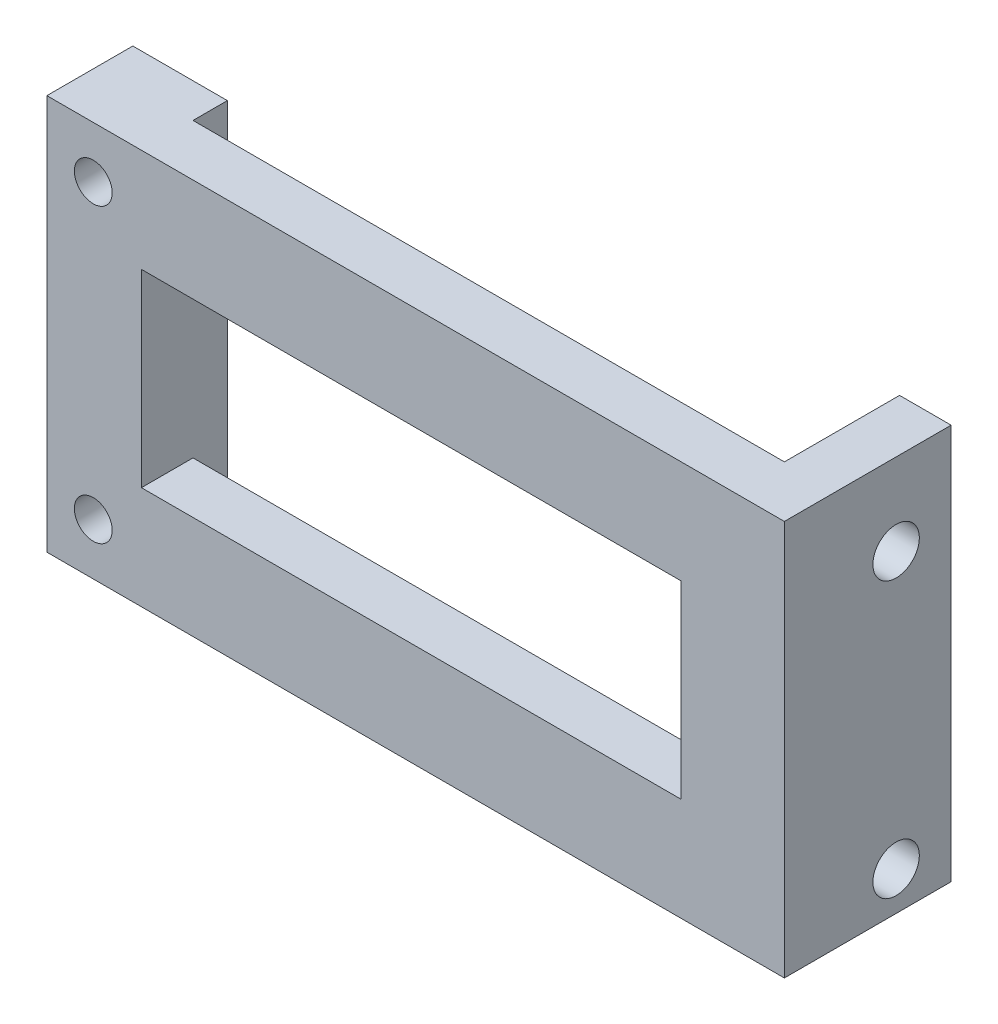
ISO-10303-21;
HEADER;
FILE_DESCRIPTION(('STEP AP214'),'2;1');
FILE_NAME('part.step','',(''),(''),'','','');
FILE_SCHEMA(('AUTOMOTIVE_DESIGN { 1 0 10303 214 1 1 1 1 }'));
ENDSEC;
DATA;
#1=APPLICATION_CONTEXT('core data for automotive mechanical design processes');
#2=APPLICATION_PROTOCOL_DEFINITION('international standard','automotive_design',2000,#1);
#3=PRODUCT_CONTEXT('',#1,'mechanical');
#4=PRODUCT('Part','Part','',(#3));
#5=PRODUCT_RELATED_PRODUCT_CATEGORY('part','',(#4));
#6=PRODUCT_DEFINITION_FORMATION('','',#4);
#7=PRODUCT_DEFINITION_CONTEXT('part definition',#1,'design');
#8=PRODUCT_DEFINITION('design','',#6,#7);
#9=PRODUCT_DEFINITION_SHAPE('','',#8);
#10=(LENGTH_UNIT() NAMED_UNIT(*) SI_UNIT(.MILLI.,.METRE.));
#11=(NAMED_UNIT(*) PLANE_ANGLE_UNIT() SI_UNIT($,.RADIAN.));
#12=(NAMED_UNIT(*) SI_UNIT($,.STERADIAN.) SOLID_ANGLE_UNIT());
#13=UNCERTAINTY_MEASURE_WITH_UNIT(LENGTH_MEASURE(1.E-05),#10,'distance_accuracy_value','');
#14=(GEOMETRIC_REPRESENTATION_CONTEXT(3) GLOBAL_UNCERTAINTY_ASSIGNED_CONTEXT((#13)) GLOBAL_UNIT_ASSIGNED_CONTEXT((#10,
#11,#12)) REPRESENTATION_CONTEXT('',''));
#15=CARTESIAN_POINT('',(0.,0.,0.));
#16=DIRECTION('',(0.,0.,1.));
#17=DIRECTION('',(1.,0.,0.));
#18=AXIS2_PLACEMENT_3D('',#15,#16,#17);
#19=CARTESIAN_POINT('',(0.,-5.50000000000001,-3.00000000000004));
#20=DIRECTION('',(0.,-1.,0.));
#21=DIRECTION('',(0.,0.,-1.));
#22=AXIS2_PLACEMENT_3D('',#19,#20,#21);
#23=PLANE('',#22);
#24=DIRECTION('',(-1.,0.,0.));
#25=VECTOR('',#24,1.);
#26=CARTESIAN_POINT('',(0.,-5.50000000000017,0.));
#27=LINE('',#26,#25);
#28=CARTESIAN_POINT('',(15.45,-5.50000000000014,0.));
#29=VERTEX_POINT('',#28);
#30=CARTESIAN_POINT('',(-15.9500000000002,-5.50000000000017,0.));
#31=VERTEX_POINT('',#30);
#32=EDGE_CURVE('E169',#29,#31,#27,.T.);
#33=ORIENTED_EDGE('',*,*,#32,.F.);
#34=DIRECTION('',(0.,0.,1.));
#35=VECTOR('',#34,1.);
#36=CARTESIAN_POINT('',(15.4499999999999,-5.50000000000014,-2.99999999999996));
#37=LINE('',#36,#35);
#38=CARTESIAN_POINT('',(15.4499999999999,-5.50000000000014,-2.99999999999996));
#39=VERTEX_POINT('',#38);
#40=EDGE_CURVE('E42',#39,#29,#37,.T.);
#41=ORIENTED_EDGE('',*,*,#40,.F.);
#42=DIRECTION('',(-1.,0.,0.));
#43=VECTOR('',#42,1.);
#44=CARTESIAN_POINT('',(0.,-5.50000000000001,-3.00000000000004));
#45=LINE('',#44,#43);
#46=CARTESIAN_POINT('',(-15.95,-5.50000000000017,-3.));
#47=VERTEX_POINT('',#46);
#48=EDGE_CURVE('E177',#39,#47,#45,.T.);
#49=ORIENTED_EDGE('',*,*,#48,.T.);
#50=DIRECTION('',(0.,0.,1.));
#51=VECTOR('',#50,1.);
#52=CARTESIAN_POINT('',(-15.95,-5.50000000000017,-3.));
#53=LINE('',#52,#51);
#54=EDGE_CURVE('E11',#47,#31,#53,.T.);
#55=ORIENTED_EDGE('',*,*,#54,.T.);
#56=EDGE_LOOP('',(#33,#41,#49,#55));
#57=FACE_BOUND('',#56,.T.);
#58=ADVANCED_FACE('F39',(#57),#23,.F.);
#59=CARTESIAN_POINT('',(0.,-11.5,-3.));
#60=DIRECTION('',(0.,1.,0.));
#61=DIRECTION('',(1.,0.,0.));
#62=AXIS2_PLACEMENT_3D('',#59,#60,#61);
#63=PLANE('',#62);
#64=DIRECTION('',(1.,0.,0.));
#65=VECTOR('',#64,1.);
#66=CARTESIAN_POINT('',(0.,-11.5000000000002,0.));
#67=LINE('',#66,#65);
#68=CARTESIAN_POINT('',(-21.4500000000002,-11.5000000000001,0.));
#69=VERTEX_POINT('',#68);
#70=CARTESIAN_POINT('',(21.45,-11.5,0.));
#71=VERTEX_POINT('',#70);
#72=EDGE_CURVE('E180',#69,#71,#67,.T.);
#73=ORIENTED_EDGE('',*,*,#72,.F.);
#74=DIRECTION('',(0.,0.,1.));
#75=VECTOR('',#74,1.);
#76=CARTESIAN_POINT('',(-21.4500000000002,-11.5000000000001,-5.));
#77=LINE('',#76,#75);
#78=CARTESIAN_POINT('',(-21.4500000000002,-11.5000000000001,-5.));
#79=VERTEX_POINT('',#78);
#80=EDGE_CURVE('E170',#79,#69,#77,.T.);
#81=ORIENTED_EDGE('',*,*,#80,.F.);
#82=DIRECTION('',(1.,0.,0.));
#83=VECTOR('',#82,1.);
#84=CARTESIAN_POINT('',(-1.66533453693773E-13,-11.5,-5.));
#85=LINE('',#84,#83);
#86=CARTESIAN_POINT('',(-15.9500000000002,-11.5000000000002,-5.));
#87=VERTEX_POINT('',#86);
#88=EDGE_CURVE('E150',#79,#87,#85,.T.);
#89=ORIENTED_EDGE('',*,*,#88,.T.);
#90=DIRECTION('',(0.,0.,1.));
#91=VECTOR('',#90,1.);
#92=CARTESIAN_POINT('',(-15.9500000000002,-11.5000000000002,-5.));
#93=LINE('',#92,#91);
#94=CARTESIAN_POINT('',(-15.9500000000002,-11.5000000000002,-3.));
#95=VERTEX_POINT('',#94);
#96=EDGE_CURVE('E173',#87,#95,#93,.T.);
#97=ORIENTED_EDGE('',*,*,#96,.T.);
#98=DIRECTION('',(1.,0.,0.));
#99=VECTOR('',#98,1.);
#100=CARTESIAN_POINT('',(0.,-11.5,-3.));
#101=LINE('',#100,#99);
#102=CARTESIAN_POINT('',(18.45,-11.5000000000002,-3.));
#103=VERTEX_POINT('',#102);
#104=EDGE_CURVE('E110',#95,#103,#101,.T.);
#105=ORIENTED_EDGE('',*,*,#104,.T.);
#106=DIRECTION('',(0.,0.,1.));
#107=VECTOR('',#106,1.);
#108=CARTESIAN_POINT('',(18.45,-11.5,-9.7));
#109=LINE('',#108,#107);
#110=CARTESIAN_POINT('',(18.45,-11.5,-9.7));
#111=VERTEX_POINT('',#110);
#112=EDGE_CURVE('E108',#111,#103,#109,.T.);
#113=ORIENTED_EDGE('',*,*,#112,.F.);
#114=DIRECTION('',(1.,0.,0.));
#115=VECTOR('',#114,1.);
#116=CARTESIAN_POINT('',(-1.66533453693773E-13,-11.5000000000002,-9.70000000000001));
#117=LINE('',#116,#115);
#118=CARTESIAN_POINT('',(21.4499999999999,-11.5,-9.7));
#119=VERTEX_POINT('',#118);
#120=EDGE_CURVE('E127',#111,#119,#117,.T.);
#121=ORIENTED_EDGE('',*,*,#120,.T.);
#122=DIRECTION('',(0.,0.,1.));
#123=VECTOR('',#122,1.);
#124=CARTESIAN_POINT('',(21.4499999999999,-11.5,-9.7));
#125=LINE('',#124,#123);
#126=EDGE_CURVE('E130',#119,#71,#125,.T.);
#127=ORIENTED_EDGE('',*,*,#126,.T.);
#128=EDGE_LOOP('',(#73,#81,#89,#97,#105,#113,#121,#127));
#129=FACE_BOUND('',#128,.T.);
#130=ADVANCED_FACE('F208',(#129),#63,.F.);
#131=CARTESIAN_POINT('',(-1.66533453693773E-13,11.5,-3.));
#132=DIRECTION('',(0.,1.,0.));
#133=DIRECTION('',(1.,0.,0.));
#134=AXIS2_PLACEMENT_3D('',#131,#132,#133);
#135=PLANE('',#134);
#136=DIRECTION('',(1.,0.,0.));
#137=VECTOR('',#136,1.);
#138=CARTESIAN_POINT('',(-1.66533453693773E-13,11.4999999999998,0.));
#139=LINE('',#138,#137);
#140=CARTESIAN_POINT('',(-21.45,11.4999999999998,0.));
#141=VERTEX_POINT('',#140);
#142=CARTESIAN_POINT('',(21.45,11.5,0.));
#143=VERTEX_POINT('',#142);
#144=EDGE_CURVE('E192',#141,#143,#139,.T.);
#145=ORIENTED_EDGE('',*,*,#144,.T.);
#146=DIRECTION('',(0.,0.,1.));
#147=VECTOR('',#146,1.);
#148=CARTESIAN_POINT('',(21.45,11.5,-9.7));
#149=LINE('',#148,#147);
#150=CARTESIAN_POINT('',(21.45,11.5,-9.7));
#151=VERTEX_POINT('',#150);
#152=EDGE_CURVE('E126',#151,#143,#149,.T.);
#153=ORIENTED_EDGE('',*,*,#152,.F.);
#154=DIRECTION('',(1.,0.,0.));
#155=VECTOR('',#154,1.);
#156=CARTESIAN_POINT('',(0.,11.4999999999998,-9.7));
#157=LINE('',#156,#155);
#158=CARTESIAN_POINT('',(18.45,11.4999999999998,-9.7));
#159=VERTEX_POINT('',#158);
#160=EDGE_CURVE('E125',#159,#151,#157,.T.);
#161=ORIENTED_EDGE('',*,*,#160,.F.);
#162=DIRECTION('',(0.,0.,1.));
#163=VECTOR('',#162,1.);
#164=CARTESIAN_POINT('',(18.45,11.4999999999998,-9.7));
#165=LINE('',#164,#163);
#166=CARTESIAN_POINT('',(18.4499999999997,11.4999999999998,-3.));
#167=VERTEX_POINT('',#166);
#168=EDGE_CURVE('E104',#159,#167,#165,.T.);
#169=ORIENTED_EDGE('',*,*,#168,.T.);
#170=DIRECTION('',(1.,0.,0.));
#171=VECTOR('',#170,1.);
#172=CARTESIAN_POINT('',(-1.66533453693773E-13,11.5,-3.));
#173=LINE('',#172,#171);
#174=CARTESIAN_POINT('',(-15.95,11.4999999999998,-3.));
#175=VERTEX_POINT('',#174);
#176=EDGE_CURVE('E111',#175,#167,#173,.T.);
#177=ORIENTED_EDGE('',*,*,#176,.F.);
#178=DIRECTION('',(0.,0.,1.));
#179=VECTOR('',#178,1.);
#180=CARTESIAN_POINT('',(-15.9500000000002,11.4999999999998,-4.99999999999996));
#181=LINE('',#180,#179);
#182=CARTESIAN_POINT('',(-15.9500000000002,11.4999999999998,-4.99999999999996));
#183=VERTEX_POINT('',#182);
#184=EDGE_CURVE('E156',#183,#175,#181,.T.);
#185=ORIENTED_EDGE('',*,*,#184,.F.);
#186=DIRECTION('',(1.,0.,0.));
#187=VECTOR('',#186,1.);
#188=CARTESIAN_POINT('',(-1.66533453693773E-13,11.5,-5.));
#189=LINE('',#188,#187);
#190=CARTESIAN_POINT('',(-21.4500000000002,11.4999999999998,-4.99999999999996));
#191=VERTEX_POINT('',#190);
#192=EDGE_CURVE('E144',#191,#183,#189,.T.);
#193=ORIENTED_EDGE('',*,*,#192,.F.);
#194=DIRECTION('',(0.,0.,1.));
#195=VECTOR('',#194,1.);
#196=CARTESIAN_POINT('',(-21.4500000000002,11.4999999999998,-4.99999999999996));
#197=LINE('',#196,#195);
#198=EDGE_CURVE('E166',#191,#141,#197,.T.);
#199=ORIENTED_EDGE('',*,*,#198,.T.);
#200=EDGE_LOOP('',(#145,#153,#161,#169,#177,#185,#193,#199));
#201=FACE_BOUND('',#200,.T.);
#202=ADVANCED_FACE('F122',(#201),#135,.T.);
#203=CARTESIAN_POINT('',(-1.38777878078145E-13,5.49999999999984,-3.));
#204=DIRECTION('',(0.,-1.,0.));
#205=DIRECTION('',(-1.,0.,0.));
#206=AXIS2_PLACEMENT_3D('',#203,#204,#205);
#207=PLANE('',#206);
#208=DIRECTION('',(-1.,0.,0.));
#209=VECTOR('',#208,1.);
#210=CARTESIAN_POINT('',(-1.66533453693773E-13,5.49999999999967,0.));
#211=LINE('',#210,#209);
#212=CARTESIAN_POINT('',(15.45,5.49999999999984,0.));
#213=VERTEX_POINT('',#212);
#214=CARTESIAN_POINT('',(-15.95,5.49999999999984,0.));
#215=VERTEX_POINT('',#214);
#216=EDGE_CURVE('E189',#213,#215,#211,.T.);
#217=ORIENTED_EDGE('',*,*,#216,.T.);
#218=DIRECTION('',(0.,0.,1.));
#219=VECTOR('',#218,1.);
#220=CARTESIAN_POINT('',(-15.9500000000002,5.49999999999984,-3.));
#221=LINE('',#220,#219);
#222=CARTESIAN_POINT('',(-15.9500000000002,5.49999999999984,-3.));
#223=VERTEX_POINT('',#222);
#224=EDGE_CURVE('E48',#223,#215,#221,.T.);
#225=ORIENTED_EDGE('',*,*,#224,.F.);
#226=DIRECTION('',(-1.,0.,0.));
#227=VECTOR('',#226,1.);
#228=CARTESIAN_POINT('',(-1.38777878078145E-13,5.49999999999984,-3.));
#229=LINE('',#228,#227);
#230=CARTESIAN_POINT('',(15.45,5.49999999999984,-3.));
#231=VERTEX_POINT('',#230);
#232=EDGE_CURVE('E182',#231,#223,#229,.T.);
#233=ORIENTED_EDGE('',*,*,#232,.F.);
#234=DIRECTION('',(0.,0.,1.));
#235=VECTOR('',#234,1.);
#236=CARTESIAN_POINT('',(15.45,5.49999999999984,-3.));
#237=LINE('',#236,#235);
#238=EDGE_CURVE('E196',#231,#213,#237,.T.);
#239=ORIENTED_EDGE('',*,*,#238,.T.);
#240=EDGE_LOOP('',(#217,#225,#233,#239));
#241=FACE_BOUND('',#240,.T.);
#242=ADVANCED_FACE('F285',(#241),#207,.T.);
#243=CARTESIAN_POINT('',(15.45,-1.66533453693773E-13,-3.));
#244=DIRECTION('',(1.,0.,0.));
#245=DIRECTION('',(0.,0.,1.));
#246=AXIS2_PLACEMENT_3D('',#243,#244,#245);
#247=PLANE('',#246);
#248=DIRECTION('',(0.,-1.,0.));
#249=VECTOR('',#248,1.);
#250=CARTESIAN_POINT('',(15.45,-1.66533453693773E-13,0.));
#251=LINE('',#250,#249);
#252=EDGE_CURVE('E71',#213,#29,#251,.T.);
#253=ORIENTED_EDGE('',*,*,#252,.F.);
#254=ORIENTED_EDGE('',*,*,#238,.F.);
#255=DIRECTION('',(0.,-1.,0.));
#256=VECTOR('',#255,1.);
#257=CARTESIAN_POINT('',(15.45,-1.66533453693773E-13,-3.));
#258=LINE('',#257,#256);
#259=EDGE_CURVE('E83',#231,#39,#258,.T.);
#260=ORIENTED_EDGE('',*,*,#259,.T.);
#261=ORIENTED_EDGE('',*,*,#40,.T.);
#262=EDGE_LOOP('',(#253,#254,#260,#261));
#263=FACE_BOUND('',#262,.T.);
#264=ADVANCED_FACE('F286',(#263),#247,.F.);
#265=CARTESIAN_POINT('',(0.,-1.66533453693773E-13,-3.));
#266=DIRECTION('',(0.,0.,1.));
#267=DIRECTION('',(-1.,0.,0.));
#268=AXIS2_PLACEMENT_3D('',#265,#266,#267);
#269=PLANE('',#268);
#270=ORIENTED_EDGE('',*,*,#48,.F.);
#271=ORIENTED_EDGE('',*,*,#259,.F.);
#272=ORIENTED_EDGE('',*,*,#232,.T.);
#273=DIRECTION('',(0.,-1.,0.));
#274=VECTOR('',#273,1.);
#275=CARTESIAN_POINT('',(-15.9500000000002,-1.66533453693773E-13,-3.));
#276=LINE('',#275,#274);
#277=EDGE_CURVE('E116',#175,#223,#276,.T.);
#278=ORIENTED_EDGE('',*,*,#277,.F.);
#279=ORIENTED_EDGE('',*,*,#176,.T.);
#280=DIRECTION('',(0.,-1.,0.));
#281=VECTOR('',#280,1.);
#282=CARTESIAN_POINT('',(18.45,-1.66533453693773E-13,-3.));
#283=LINE('',#282,#281);
#284=EDGE_CURVE('E98',#167,#103,#283,.T.);
#285=ORIENTED_EDGE('',*,*,#284,.T.);
#286=ORIENTED_EDGE('',*,*,#104,.F.);
#287=EDGE_CURVE('E57',#47,#95,#276,.T.);
#288=ORIENTED_EDGE('',*,*,#287,.F.);
#289=EDGE_LOOP('',(#270,#271,#272,#278,#279,#285,#286,#288));
#290=FACE_BOUND('',#289,.T.);
#291=ADVANCED_FACE('F114',(#290),#269,.F.);
#292=CARTESIAN_POINT('',(0.,0.,0.));
#293=DIRECTION('',(0.,0.,1.));
#294=DIRECTION('',(-1.,0.,0.));
#295=AXIS2_PLACEMENT_3D('',#292,#293,#294);
#296=PLANE('',#295);
#297=ORIENTED_EDGE('',*,*,#216,.F.);
#298=ORIENTED_EDGE('',*,*,#252,.T.);
#299=ORIENTED_EDGE('',*,*,#32,.T.);
#300=DIRECTION('',(0.,-1.,0.));
#301=VECTOR('',#300,1.);
#302=CARTESIAN_POINT('',(-15.9500000000002,0.,0.));
#303=LINE('',#302,#301);
#304=EDGE_CURVE('E78',#215,#31,#303,.T.);
#305=ORIENTED_EDGE('',*,*,#304,.F.);
#306=EDGE_LOOP('',(#297,#298,#299,#305));
#307=FACE_BOUND('',#306,.T.);
#308=DIRECTION('',(0.,-1.,0.));
#309=VECTOR('',#308,1.);
#310=CARTESIAN_POINT('',(-21.4500000000002,-1.66533453693773E-13,0.));
#311=LINE('',#310,#309);
#312=EDGE_CURVE('E141',#141,#69,#311,.T.);
#313=ORIENTED_EDGE('',*,*,#312,.T.);
#314=ORIENTED_EDGE('',*,*,#72,.T.);
#315=DIRECTION('',(0.,-1.,0.));
#316=VECTOR('',#315,1.);
#317=CARTESIAN_POINT('',(21.4499999999997,-1.66533453693773E-13,0.));
#318=LINE('',#317,#316);
#319=EDGE_CURVE('E248',#143,#71,#318,.T.);
#320=ORIENTED_EDGE('',*,*,#319,.F.);
#321=ORIENTED_EDGE('',*,*,#144,.F.);
#322=EDGE_LOOP('',(#313,#314,#320,#321));
#323=FACE_BOUND('',#322,.T.);
#324=CARTESIAN_POINT('',(-18.7500000000002,8.49999999999998,0.));
#325=DIRECTION('',(0.,0.,-1.));
#326=DIRECTION('',(-1.,0.,0.));
#327=AXIS2_PLACEMENT_3D('',#324,#325,#326);
#328=CIRCLE('',#327,1.1);
#329=CARTESIAN_POINT('',(-19.8500000000002,8.49999999999998,0.));
#330=VERTEX_POINT('',#329);
#331=EDGE_CURVE('E157',#330,#330,#328,.T.);
#332=ORIENTED_EDGE('',*,*,#331,.T.);
#333=EDGE_LOOP('',(#332));
#334=FACE_BOUND('',#333,.T.);
#335=CARTESIAN_POINT('',(-18.75,-8.50000000000001,0.));
#336=DIRECTION('',(0.,0.,-1.));
#337=DIRECTION('',(-1.,0.,0.));
#338=AXIS2_PLACEMENT_3D('',#335,#336,#337);
#339=CIRCLE('',#338,1.1);
#340=CARTESIAN_POINT('',(-19.85,-8.50000000000001,0.));
#341=VERTEX_POINT('',#340);
#342=EDGE_CURVE('E160',#341,#341,#339,.T.);
#343=ORIENTED_EDGE('',*,*,#342,.T.);
#344=EDGE_LOOP('',(#343));
#345=FACE_BOUND('',#344,.T.);
#346=ADVANCED_FACE('F261',(#307,#323,#334,#345),#296,.T.);
#347=CARTESIAN_POINT('',(-15.95,-1.66533453693773E-13,-5.));
#348=DIRECTION('',(1.,0.,0.));
#349=DIRECTION('',(0.,-1.,0.));
#350=AXIS2_PLACEMENT_3D('',#347,#348,#349);
#351=PLANE('',#350);
#352=ORIENTED_EDGE('',*,*,#304,.T.);
#353=ORIENTED_EDGE('',*,*,#54,.F.);
#354=ORIENTED_EDGE('',*,*,#287,.T.);
#355=ORIENTED_EDGE('',*,*,#96,.F.);
#356=DIRECTION('',(0.,-1.,0.));
#357=VECTOR('',#356,1.);
#358=CARTESIAN_POINT('',(-15.95,-1.66533453693773E-13,-5.));
#359=LINE('',#358,#357);
#360=EDGE_CURVE('E147',#183,#87,#359,.T.);
#361=ORIENTED_EDGE('',*,*,#360,.F.);
#362=ORIENTED_EDGE('',*,*,#184,.T.);
#363=ORIENTED_EDGE('',*,*,#277,.T.);
#364=ORIENTED_EDGE('',*,*,#224,.T.);
#365=EDGE_LOOP('',(#352,#353,#354,#355,#361,#362,#363,#364));
#366=FACE_BOUND('',#365,.T.);
#367=ADVANCED_FACE('F203',(#366),#351,.T.);
#368=CARTESIAN_POINT('',(-21.4500000000002,-1.66533453693773E-13,-4.99999999999996));
#369=DIRECTION('',(1.,0.,0.));
#370=DIRECTION('',(0.,-1.,0.));
#371=AXIS2_PLACEMENT_3D('',#368,#369,#370);
#372=PLANE('',#371);
#373=ORIENTED_EDGE('',*,*,#312,.F.);
#374=ORIENTED_EDGE('',*,*,#198,.F.);
#375=DIRECTION('',(0.,-1.,0.));
#376=VECTOR('',#375,1.);
#377=CARTESIAN_POINT('',(-21.4500000000002,-1.66533453693773E-13,-4.99999999999996));
#378=LINE('',#377,#376);
#379=EDGE_CURVE('E153',#191,#79,#378,.T.);
#380=ORIENTED_EDGE('',*,*,#379,.T.);
#381=ORIENTED_EDGE('',*,*,#80,.T.);
#382=EDGE_LOOP('',(#373,#374,#380,#381));
#383=FACE_BOUND('',#382,.T.);
#384=ADVANCED_FACE('F264',(#383),#372,.F.);
#385=CARTESIAN_POINT('',(-18.75,-8.50000000000017,-5.));
#386=DIRECTION('',(0.,0.,1.));
#387=DIRECTION('',(-1.,0.,0.));
#388=AXIS2_PLACEMENT_3D('',#385,#386,#387);
#389=CYLINDRICAL_SURFACE('',#388,1.1);
#390=CARTESIAN_POINT('',(-18.75,-8.50000000000017,-5.));
#391=DIRECTION('',(0.,0.,-1.));
#392=DIRECTION('',(-1.,0.,0.));
#393=AXIS2_PLACEMENT_3D('',#390,#391,#392);
#394=CIRCLE('',#393,1.1);
#395=CARTESIAN_POINT('',(-19.85,-8.50000000000017,-5.));
#396=VERTEX_POINT('',#395);
#397=EDGE_CURVE('E140',#396,#396,#394,.T.);
#398=ORIENTED_EDGE('',*,*,#397,.T.);
#399=EDGE_LOOP('',(#398));
#400=FACE_BOUND('',#399,.T.);
#401=ORIENTED_EDGE('',*,*,#342,.F.);
#402=EDGE_LOOP('',(#401));
#403=FACE_BOUND('',#402,.T.);
#404=ADVANCED_FACE('F266',(#400,#403),#389,.F.);
#405=CARTESIAN_POINT('',(-18.75,8.49999999999981,-5.));
#406=DIRECTION('',(0.,0.,1.));
#407=DIRECTION('',(-1.,0.,0.));
#408=AXIS2_PLACEMENT_3D('',#405,#406,#407);
#409=CYLINDRICAL_SURFACE('',#408,1.1);
#410=CARTESIAN_POINT('',(-18.75,8.49999999999981,-5.));
#411=DIRECTION('',(0.,0.,-1.));
#412=DIRECTION('',(-1.,0.,0.));
#413=AXIS2_PLACEMENT_3D('',#410,#411,#412);
#414=CIRCLE('',#413,1.1);
#415=CARTESIAN_POINT('',(-19.85,8.49999999999981,-5.));
#416=VERTEX_POINT('',#415);
#417=EDGE_CURVE('E137',#416,#416,#414,.T.);
#418=ORIENTED_EDGE('',*,*,#417,.T.);
#419=EDGE_LOOP('',(#418));
#420=FACE_BOUND('',#419,.T.);
#421=ORIENTED_EDGE('',*,*,#331,.F.);
#422=EDGE_LOOP('',(#421));
#423=FACE_BOUND('',#422,.T.);
#424=ADVANCED_FACE('F272',(#420,#423),#409,.F.);
#425=CARTESIAN_POINT('',(0.,-1.66533453693773E-13,-5.));
#426=DIRECTION('',(0.,0.,1.));
#427=DIRECTION('',(-1.,0.,0.));
#428=AXIS2_PLACEMENT_3D('',#425,#426,#427);
#429=PLANE('',#428);
#430=ORIENTED_EDGE('',*,*,#417,.F.);
#431=EDGE_LOOP('',(#430));
#432=FACE_BOUND('',#431,.T.);
#433=ORIENTED_EDGE('',*,*,#397,.F.);
#434=EDGE_LOOP('',(#433));
#435=FACE_BOUND('',#434,.T.);
#436=ORIENTED_EDGE('',*,*,#192,.T.);
#437=ORIENTED_EDGE('',*,*,#360,.T.);
#438=ORIENTED_EDGE('',*,*,#88,.F.);
#439=ORIENTED_EDGE('',*,*,#379,.F.);
#440=EDGE_LOOP('',(#436,#437,#438,#439));
#441=FACE_BOUND('',#440,.T.);
#442=ADVANCED_FACE('F216',(#432,#435,#441),#429,.F.);
#443=CARTESIAN_POINT('',(18.45,-3.33066907387547E-13,-9.7));
#444=DIRECTION('',(1.,0.,0.));
#445=DIRECTION('',(0.,-1.,0.));
#446=AXIS2_PLACEMENT_3D('',#443,#444,#445);
#447=PLANE('',#446);
#448=CARTESIAN_POINT('',(18.45,-9.25000000000034,-6.5));
#449=DIRECTION('',(-1.,0.,0.));
#450=DIRECTION('',(0.,-1.,0.));
#451=AXIS2_PLACEMENT_3D('',#448,#449,#450);
#452=CIRCLE('',#451,1.35);
#453=CARTESIAN_POINT('',(18.45,-10.6000000000003,-6.5));
#454=VERTEX_POINT('',#453);
#455=EDGE_CURVE('E337',#454,#454,#452,.F.);
#456=ORIENTED_EDGE('',*,*,#455,.T.);
#457=EDGE_LOOP('',(#456));
#458=FACE_BOUND('',#457,.T.);
#459=CARTESIAN_POINT('',(18.45,6.74999999999967,-6.5));
#460=DIRECTION('',(-1.,0.,0.));
#461=DIRECTION('',(0.,-1.,0.));
#462=AXIS2_PLACEMENT_3D('',#459,#460,#461);
#463=CIRCLE('',#462,1.35);
#464=CARTESIAN_POINT('',(18.45,5.39999999999967,-6.5));
#465=VERTEX_POINT('',#464);
#466=EDGE_CURVE('E251',#465,#465,#463,.F.);
#467=ORIENTED_EDGE('',*,*,#466,.T.);
#468=EDGE_LOOP('',(#467));
#469=FACE_BOUND('',#468,.T.);
#470=ORIENTED_EDGE('',*,*,#168,.F.);
#471=DIRECTION('',(0.,-1.,0.));
#472=VECTOR('',#471,1.);
#473=CARTESIAN_POINT('',(18.45,-3.33066907387547E-13,-9.7));
#474=LINE('',#473,#472);
#475=EDGE_CURVE('E246',#159,#111,#474,.T.);
#476=ORIENTED_EDGE('',*,*,#475,.T.);
#477=ORIENTED_EDGE('',*,*,#112,.T.);
#478=ORIENTED_EDGE('',*,*,#284,.F.);
#479=EDGE_LOOP('',(#470,#476,#477,#478));
#480=FACE_BOUND('',#479,.T.);
#481=ADVANCED_FACE('F100',(#458,#469,#480),#447,.F.);
#482=CARTESIAN_POINT('',(21.4500000000003,0.,-9.7));
#483=DIRECTION('',(1.,0.,0.));
#484=DIRECTION('',(0.,-1.,0.));
#485=AXIS2_PLACEMENT_3D('',#482,#483,#484);
#486=PLANE('',#485);
#487=CARTESIAN_POINT('',(21.45,-9.25000000000034,-6.5));
#488=DIRECTION('',(-1.,0.,0.));
#489=DIRECTION('',(0.,-1.,0.));
#490=AXIS2_PLACEMENT_3D('',#487,#488,#489);
#491=CIRCLE('',#490,1.35);
#492=CARTESIAN_POINT('',(21.45,-10.6000000000003,-6.5));
#493=VERTEX_POINT('',#492);
#494=EDGE_CURVE('E340',#493,#493,#491,.T.);
#495=ORIENTED_EDGE('',*,*,#494,.T.);
#496=EDGE_LOOP('',(#495));
#497=FACE_BOUND('',#496,.T.);
#498=CARTESIAN_POINT('',(21.4500000000003,6.74999999999984,-6.49999999999998));
#499=DIRECTION('',(-1.,0.,0.));
#500=DIRECTION('',(0.,-1.,0.));
#501=AXIS2_PLACEMENT_3D('',#498,#499,#500);
#502=CIRCLE('',#501,1.35);
#503=CARTESIAN_POINT('',(21.4500000000003,5.39999999999984,-6.49999999999998));
#504=VERTEX_POINT('',#503);
#505=EDGE_CURVE('E342',#504,#504,#502,.T.);
#506=ORIENTED_EDGE('',*,*,#505,.T.);
#507=EDGE_LOOP('',(#506));
#508=FACE_BOUND('',#507,.T.);
#509=ORIENTED_EDGE('',*,*,#319,.T.);
#510=ORIENTED_EDGE('',*,*,#126,.F.);
#511=DIRECTION('',(0.,-1.,0.));
#512=VECTOR('',#511,1.);
#513=CARTESIAN_POINT('',(21.4500000000003,0.,-9.7));
#514=LINE('',#513,#512);
#515=EDGE_CURVE('E133',#151,#119,#514,.T.);
#516=ORIENTED_EDGE('',*,*,#515,.F.);
#517=ORIENTED_EDGE('',*,*,#152,.T.);
#518=EDGE_LOOP('',(#509,#510,#516,#517));
#519=FACE_BOUND('',#518,.T.);
#520=ADVANCED_FACE('F316',(#497,#508,#519),#486,.T.);
#521=CARTESIAN_POINT('',(0.,0.,-9.7));
#522=DIRECTION('',(0.,0.,1.));
#523=DIRECTION('',(-1.,0.,0.));
#524=AXIS2_PLACEMENT_3D('',#521,#522,#523);
#525=PLANE('',#524);
#526=ORIENTED_EDGE('',*,*,#475,.F.);
#527=ORIENTED_EDGE('',*,*,#160,.T.);
#528=ORIENTED_EDGE('',*,*,#515,.T.);
#529=ORIENTED_EDGE('',*,*,#120,.F.);
#530=EDGE_LOOP('',(#526,#527,#528,#529));
#531=FACE_BOUND('',#530,.T.);
#532=ADVANCED_FACE('F247',(#531),#525,.F.);
#533=CARTESIAN_POINT('',(14.6316233815927,6.74999999999984,-6.5));
#534=DIRECTION('',(1.,0.,0.));
#535=DIRECTION('',(0.,-1.,0.));
#536=AXIS2_PLACEMENT_3D('',#533,#534,#535);
#537=CYLINDRICAL_SURFACE('',#536,1.35);
#538=ORIENTED_EDGE('',*,*,#466,.F.);
#539=EDGE_LOOP('',(#538));
#540=FACE_BOUND('',#539,.T.);
#541=ORIENTED_EDGE('',*,*,#505,.F.);
#542=EDGE_LOOP('',(#541));
#543=FACE_BOUND('',#542,.T.);
#544=ADVANCED_FACE('F325',(#540,#543),#537,.F.);
#545=CARTESIAN_POINT('',(14.6316233815925,-9.25000000000017,-6.50000000000004));
#546=DIRECTION('',(1.,0.,0.));
#547=DIRECTION('',(0.,-1.,0.));
#548=AXIS2_PLACEMENT_3D('',#545,#546,#547);
#549=CYLINDRICAL_SURFACE('',#548,1.35);
#550=ORIENTED_EDGE('',*,*,#455,.F.);
#551=EDGE_LOOP('',(#550));
#552=FACE_BOUND('',#551,.T.);
#553=ORIENTED_EDGE('',*,*,#494,.F.);
#554=EDGE_LOOP('',(#553));
#555=FACE_BOUND('',#554,.T.);
#556=ADVANCED_FACE('F328',(#552,#555),#549,.F.);
#557=CLOSED_SHELL('',(#58,#130,#202,#242,#264,#291,#346,#367,#384,#404,#424,#442,#481,#520,#532,
#544,#556));
#558=MANIFOLD_SOLID_BREP('B2',#557);
#559=ADVANCED_BREP_SHAPE_REPRESENTATION('',(#18,#558),#14);
#560=SHAPE_DEFINITION_REPRESENTATION(#9,#559);
ENDSEC;
END-ISO-10303-21;
